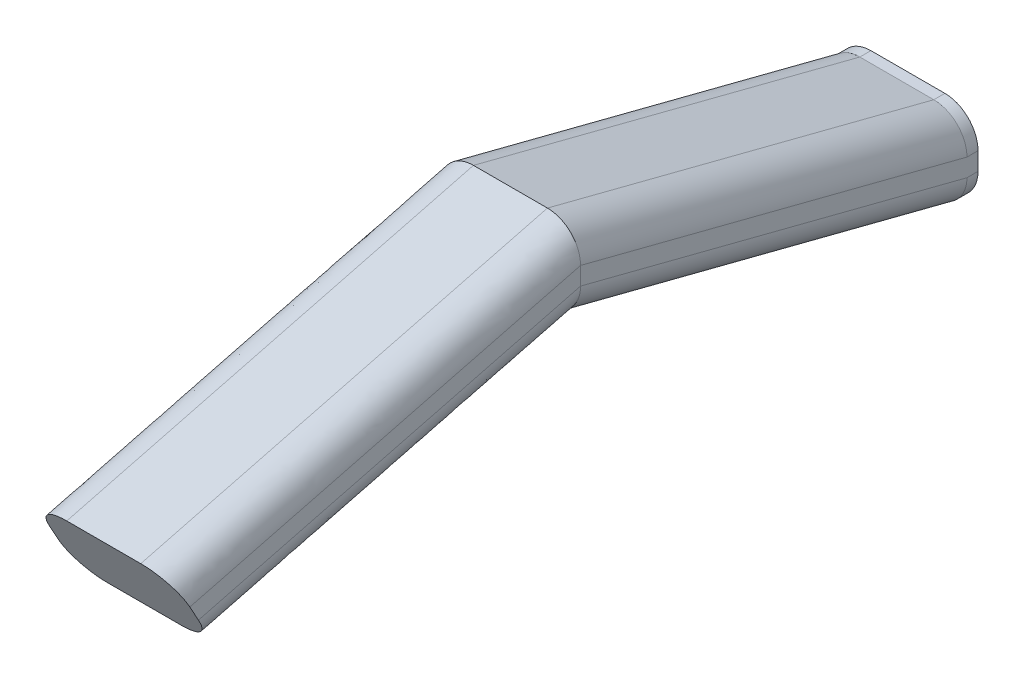
ISO-10303-21;
HEADER;
FILE_DESCRIPTION(('STEP AP214'),'2;1');
FILE_NAME('part.step','',(''),(''),'','','');
FILE_SCHEMA(('AUTOMOTIVE_DESIGN { 1 0 10303 214 1 1 1 1 }'));
ENDSEC;
DATA;
#1=APPLICATION_CONTEXT('core data for automotive mechanical design processes');
#2=APPLICATION_PROTOCOL_DEFINITION('international standard','automotive_design',2000,#1);
#3=PRODUCT_CONTEXT('',#1,'mechanical');
#4=PRODUCT('Part','Part','',(#3));
#5=PRODUCT_RELATED_PRODUCT_CATEGORY('part','',(#4));
#6=PRODUCT_DEFINITION_FORMATION('','',#4);
#7=PRODUCT_DEFINITION_CONTEXT('part definition',#1,'design');
#8=PRODUCT_DEFINITION('design','',#6,#7);
#9=PRODUCT_DEFINITION_SHAPE('','',#8);
#10=(LENGTH_UNIT() NAMED_UNIT(*) SI_UNIT(.MILLI.,.METRE.));
#11=(NAMED_UNIT(*) PLANE_ANGLE_UNIT() SI_UNIT($,.RADIAN.));
#12=(NAMED_UNIT(*) SI_UNIT($,.STERADIAN.) SOLID_ANGLE_UNIT());
#13=UNCERTAINTY_MEASURE_WITH_UNIT(LENGTH_MEASURE(1.E-05),#10,'distance_accuracy_value','');
#14=(GEOMETRIC_REPRESENTATION_CONTEXT(3) GLOBAL_UNCERTAINTY_ASSIGNED_CONTEXT((#13)) GLOBAL_UNIT_ASSIGNED_CONTEXT((#10,
#11,#12)) REPRESENTATION_CONTEXT('',''));
#15=CARTESIAN_POINT('',(0.,0.,0.));
#16=DIRECTION('',(0.,0.,1.));
#17=DIRECTION('',(1.,0.,0.));
#18=AXIS2_PLACEMENT_3D('',#15,#16,#17);
#19=CARTESIAN_POINT('',(-33.5,-8.1,10.));
#20=DIRECTION('',(0.,0.,-1.));
#21=DIRECTION('',(-1.,0.,0.));
#22=AXIS2_PLACEMENT_3D('',#19,#20,#21);
#23=CYLINDRICAL_SURFACE('',#22,30.);
#24=CARTESIAN_POINT('',(-33.5,-8.1,0.));
#25=DIRECTION('',(0.,0.,1.));
#26=DIRECTION('',(-1.,0.,0.));
#27=AXIS2_PLACEMENT_3D('',#24,#25,#26);
#28=CIRCLE('',#27,30.);
#29=CARTESIAN_POINT('',(-63.5,-8.1,0.));
#30=VERTEX_POINT('',#29);
#31=CARTESIAN_POINT('',(-33.5,-38.1,0.));
#32=VERTEX_POINT('',#31);
#33=EDGE_CURVE('E167',#30,#32,#28,.T.);
#34=ORIENTED_EDGE('',*,*,#33,.T.);
#35=DIRECTION('',(0.,0.,-1.));
#36=VECTOR('',#35,1.);
#37=CARTESIAN_POINT('',(-33.5,-38.1,10.));
#38=LINE('',#37,#36);
#39=CARTESIAN_POINT('',(-33.5,-38.1,10.));
#40=VERTEX_POINT('',#39);
#41=EDGE_CURVE('E11',#40,#32,#38,.T.);
#42=ORIENTED_EDGE('',*,*,#41,.F.);
#43=CARTESIAN_POINT('',(-33.5,-8.1,10.));
#44=DIRECTION('',(0.,0.,1.));
#45=DIRECTION('',(-1.,0.,0.));
#46=AXIS2_PLACEMENT_3D('',#43,#44,#45);
#47=CIRCLE('',#46,30.);
#48=CARTESIAN_POINT('',(-63.5,-8.09999999999998,10.));
#49=VERTEX_POINT('',#48);
#50=EDGE_CURVE('E159',#49,#40,#47,.T.);
#51=ORIENTED_EDGE('',*,*,#50,.F.);
#52=DIRECTION('',(0.,0.,-1.));
#53=VECTOR('',#52,1.);
#54=CARTESIAN_POINT('',(-63.5,-8.1,10.));
#55=LINE('',#54,#53);
#56=EDGE_CURVE('E166',#49,#30,#55,.T.);
#57=ORIENTED_EDGE('',*,*,#56,.T.);
#58=EDGE_LOOP('',(#34,#42,#51,#57));
#59=FACE_BOUND('',#58,.T.);
#60=ADVANCED_FACE('F33',(#59),#23,.T.);
#61=CARTESIAN_POINT('',(-33.5,-38.1,10.));
#62=DIRECTION('',(0.,1.,0.));
#63=DIRECTION('',(0.,0.,1.));
#64=AXIS2_PLACEMENT_3D('',#61,#62,#63);
#65=PLANE('',#64);
#66=DIRECTION('',(1.,0.,0.));
#67=VECTOR('',#66,1.);
#68=CARTESIAN_POINT('',(-33.5,-38.1,0.));
#69=LINE('',#68,#67);
#70=CARTESIAN_POINT('',(33.5,-38.1,0.));
#71=VERTEX_POINT('',#70);
#72=EDGE_CURVE('E170',#32,#71,#69,.T.);
#73=ORIENTED_EDGE('',*,*,#72,.T.);
#74=DIRECTION('',(0.,0.,-1.));
#75=VECTOR('',#74,1.);
#76=CARTESIAN_POINT('',(33.5,-38.1,10.));
#77=LINE('',#76,#75);
#78=CARTESIAN_POINT('',(33.5,-38.1,10.));
#79=VERTEX_POINT('',#78);
#80=EDGE_CURVE('E41',#79,#71,#77,.T.);
#81=ORIENTED_EDGE('',*,*,#80,.F.);
#82=DIRECTION('',(1.,0.,0.));
#83=VECTOR('',#82,1.);
#84=CARTESIAN_POINT('',(-33.5,-38.1,10.));
#85=LINE('',#84,#83);
#86=EDGE_CURVE('E91',#40,#79,#85,.T.);
#87=ORIENTED_EDGE('',*,*,#86,.F.);
#88=ORIENTED_EDGE('',*,*,#41,.T.);
#89=EDGE_LOOP('',(#73,#81,#87,#88));
#90=FACE_BOUND('',#89,.T.);
#91=ADVANCED_FACE('F329',(#90),#65,.F.);
#92=CARTESIAN_POINT('',(33.5,-8.1,10.));
#93=DIRECTION('',(0.,0.,-1.));
#94=DIRECTION('',(-1.,0.,0.));
#95=AXIS2_PLACEMENT_3D('',#92,#93,#94);
#96=CYLINDRICAL_SURFACE('',#95,30.);
#97=CARTESIAN_POINT('',(33.5,-8.1,0.));
#98=DIRECTION('',(0.,0.,1.));
#99=DIRECTION('',(1.,0.,0.));
#100=AXIS2_PLACEMENT_3D('',#97,#98,#99);
#101=CIRCLE('',#100,30.);
#102=CARTESIAN_POINT('',(63.5,-8.1,0.));
#103=VERTEX_POINT('',#102);
#104=EDGE_CURVE('E173',#71,#103,#101,.T.);
#105=ORIENTED_EDGE('',*,*,#104,.T.);
#106=DIRECTION('',(0.,0.,-1.));
#107=VECTOR('',#106,1.);
#108=CARTESIAN_POINT('',(63.5,-8.1,10.));
#109=LINE('',#108,#107);
#110=CARTESIAN_POINT('',(63.5,-8.1,10.));
#111=VERTEX_POINT('',#110);
#112=EDGE_CURVE('E186',#111,#103,#109,.T.);
#113=ORIENTED_EDGE('',*,*,#112,.F.);
#114=CARTESIAN_POINT('',(33.5,-8.1,10.));
#115=DIRECTION('',(0.,0.,1.));
#116=DIRECTION('',(1.,0.,0.));
#117=AXIS2_PLACEMENT_3D('',#114,#115,#116);
#118=CIRCLE('',#117,30.);
#119=EDGE_CURVE('E139',#79,#111,#118,.T.);
#120=ORIENTED_EDGE('',*,*,#119,.F.);
#121=ORIENTED_EDGE('',*,*,#80,.T.);
#122=EDGE_LOOP('',(#105,#113,#120,#121));
#123=FACE_BOUND('',#122,.T.);
#124=ADVANCED_FACE('F192',(#123),#96,.T.);
#125=CARTESIAN_POINT('',(63.5,-8.1,10.));
#126=DIRECTION('',(-1.,0.,0.));
#127=DIRECTION('',(0.,0.,1.));
#128=AXIS2_PLACEMENT_3D('',#125,#126,#127);
#129=PLANE('',#128);
#130=DIRECTION('',(0.,1.,0.));
#131=VECTOR('',#130,1.);
#132=CARTESIAN_POINT('',(63.5,-8.1,0.));
#133=LINE('',#132,#131);
#134=CARTESIAN_POINT('',(63.5,8.1,0.));
#135=VERTEX_POINT('',#134);
#136=EDGE_CURVE('E175',#103,#135,#133,.T.);
#137=ORIENTED_EDGE('',*,*,#136,.T.);
#138=DIRECTION('',(0.,0.,-1.));
#139=VECTOR('',#138,1.);
#140=CARTESIAN_POINT('',(63.5,8.1,10.));
#141=LINE('',#140,#139);
#142=CARTESIAN_POINT('',(63.5,8.1,10.));
#143=VERTEX_POINT('',#142);
#144=EDGE_CURVE('E118',#143,#135,#141,.T.);
#145=ORIENTED_EDGE('',*,*,#144,.F.);
#146=DIRECTION('',(0.,-0.249041039810618,-0.96849293259685));
#147=VECTOR('',#146,1.);
#148=CARTESIAN_POINT('',(63.5,98.1,360.));
#149=LINE('',#148,#147);
#150=CARTESIAN_POINT('',(63.5,98.0999999999999,360.));
#151=VERTEX_POINT('',#150);
#152=EDGE_CURVE('E138',#151,#143,#149,.T.);
#153=ORIENTED_EDGE('',*,*,#152,.F.);
#154=DIRECTION('',(0.,-1.,0.));
#155=VECTOR('',#154,1.);
#156=CARTESIAN_POINT('',(63.5,-7.09525267993879,360.));
#157=LINE('',#156,#155);
#158=CARTESIAN_POINT('',(63.5,81.9,360.));
#159=VERTEX_POINT('',#158);
#160=EDGE_CURVE('E378',#151,#159,#157,.T.);
#161=ORIENTED_EDGE('',*,*,#160,.T.);
#162=DIRECTION('',(0.,-0.249041039810618,-0.96849293259685));
#163=VECTOR('',#162,1.);
#164=CARTESIAN_POINT('',(63.5,81.9,360.));
#165=LINE('',#164,#163);
#166=EDGE_CURVE('E149',#159,#111,#165,.T.);
#167=ORIENTED_EDGE('',*,*,#166,.T.);
#168=ORIENTED_EDGE('',*,*,#112,.T.);
#169=EDGE_LOOP('',(#137,#145,#153,#161,#167,#168));
#170=FACE_BOUND('',#169,.T.);
#171=ADVANCED_FACE('F198',(#170),#129,.F.);
#172=CARTESIAN_POINT('',(33.5,8.1,10.));
#173=DIRECTION('',(0.,0.,-1.));
#174=DIRECTION('',(-1.,0.,0.));
#175=AXIS2_PLACEMENT_3D('',#172,#173,#174);
#176=CYLINDRICAL_SURFACE('',#175,30.);
#177=CARTESIAN_POINT('',(33.5,8.1,0.));
#178=DIRECTION('',(0.,0.,1.));
#179=DIRECTION('',(-1.,0.,0.));
#180=AXIS2_PLACEMENT_3D('',#177,#178,#179);
#181=CIRCLE('',#180,30.);
#182=CARTESIAN_POINT('',(33.5,38.1,0.));
#183=VERTEX_POINT('',#182);
#184=EDGE_CURVE('E115',#135,#183,#181,.T.);
#185=ORIENTED_EDGE('',*,*,#184,.T.);
#186=DIRECTION('',(0.,0.,-1.));
#187=VECTOR('',#186,1.);
#188=CARTESIAN_POINT('',(33.5,38.1,10.));
#189=LINE('',#188,#187);
#190=CARTESIAN_POINT('',(33.5,38.1,10.));
#191=VERTEX_POINT('',#190);
#192=EDGE_CURVE('E107',#191,#183,#189,.T.);
#193=ORIENTED_EDGE('',*,*,#192,.F.);
#194=CARTESIAN_POINT('',(33.5,8.1,10.));
#195=DIRECTION('',(0.,0.,1.));
#196=DIRECTION('',(-1.,0.,0.));
#197=AXIS2_PLACEMENT_3D('',#194,#195,#196);
#198=CIRCLE('',#197,30.);
#199=EDGE_CURVE('E112',#143,#191,#198,.T.);
#200=ORIENTED_EDGE('',*,*,#199,.F.);
#201=ORIENTED_EDGE('',*,*,#144,.T.);
#202=EDGE_LOOP('',(#185,#193,#200,#201));
#203=FACE_BOUND('',#202,.T.);
#204=ADVANCED_FACE('F109',(#203),#176,.T.);
#205=CARTESIAN_POINT('',(-33.5,38.1,10.));
#206=DIRECTION('',(0.,-1.,0.));
#207=DIRECTION('',(0.,0.,-1.));
#208=AXIS2_PLACEMENT_3D('',#205,#206,#207);
#209=PLANE('',#208);
#210=DIRECTION('',(-1.,0.,0.));
#211=VECTOR('',#210,1.);
#212=CARTESIAN_POINT('',(-33.5,38.1,0.));
#213=LINE('',#212,#211);
#214=CARTESIAN_POINT('',(-33.5,38.1,0.));
#215=VERTEX_POINT('',#214);
#216=EDGE_CURVE('E178',#183,#215,#213,.T.);
#217=ORIENTED_EDGE('',*,*,#216,.T.);
#218=DIRECTION('',(0.,0.,-1.));
#219=VECTOR('',#218,1.);
#220=CARTESIAN_POINT('',(-33.5,38.1,10.));
#221=LINE('',#220,#219);
#222=CARTESIAN_POINT('',(-33.5,38.1,10.));
#223=VERTEX_POINT('',#222);
#224=EDGE_CURVE('E119',#223,#215,#221,.T.);
#225=ORIENTED_EDGE('',*,*,#224,.F.);
#226=DIRECTION('',(-1.,0.,0.));
#227=VECTOR('',#226,1.);
#228=CARTESIAN_POINT('',(-33.5,38.1,10.));
#229=LINE('',#228,#227);
#230=EDGE_CURVE('E122',#191,#223,#229,.T.);
#231=ORIENTED_EDGE('',*,*,#230,.F.);
#232=ORIENTED_EDGE('',*,*,#192,.T.);
#233=EDGE_LOOP('',(#217,#225,#231,#232));
#234=FACE_BOUND('',#233,.T.);
#235=ADVANCED_FACE('F123',(#234),#209,.F.);
#236=CARTESIAN_POINT('',(-33.5,8.1,10.));
#237=DIRECTION('',(0.,0.,-1.));
#238=DIRECTION('',(-1.,0.,0.));
#239=AXIS2_PLACEMENT_3D('',#236,#237,#238);
#240=CYLINDRICAL_SURFACE('',#239,30.);
#241=CARTESIAN_POINT('',(-33.5,8.1,0.));
#242=DIRECTION('',(0.,0.,1.));
#243=DIRECTION('',(-1.,0.,0.));
#244=AXIS2_PLACEMENT_3D('',#241,#242,#243);
#245=CIRCLE('',#244,30.);
#246=CARTESIAN_POINT('',(-63.5,8.1,0.));
#247=VERTEX_POINT('',#246);
#248=EDGE_CURVE('E77',#215,#247,#245,.T.);
#249=ORIENTED_EDGE('',*,*,#248,.T.);
#250=DIRECTION('',(0.,0.,-1.));
#251=VECTOR('',#250,1.);
#252=CARTESIAN_POINT('',(-63.5,8.1,10.));
#253=LINE('',#252,#251);
#254=CARTESIAN_POINT('',(-63.5,8.1,10.));
#255=VERTEX_POINT('',#254);
#256=EDGE_CURVE('E49',#255,#247,#253,.T.);
#257=ORIENTED_EDGE('',*,*,#256,.F.);
#258=CARTESIAN_POINT('',(-33.5,8.1,10.));
#259=DIRECTION('',(0.,0.,1.));
#260=DIRECTION('',(-1.,0.,0.));
#261=AXIS2_PLACEMENT_3D('',#258,#259,#260);
#262=CIRCLE('',#261,30.);
#263=EDGE_CURVE('E128',#223,#255,#262,.T.);
#264=ORIENTED_EDGE('',*,*,#263,.F.);
#265=ORIENTED_EDGE('',*,*,#224,.T.);
#266=EDGE_LOOP('',(#249,#257,#264,#265));
#267=FACE_BOUND('',#266,.T.);
#268=ADVANCED_FACE('F335',(#267),#240,.T.);
#269=CARTESIAN_POINT('',(-63.5,-8.1,10.));
#270=DIRECTION('',(1.,0.,0.));
#271=DIRECTION('',(0.,0.,-1.));
#272=AXIS2_PLACEMENT_3D('',#269,#270,#271);
#273=PLANE('',#272);
#274=DIRECTION('',(0.,-1.,0.));
#275=VECTOR('',#274,1.);
#276=CARTESIAN_POINT('',(-63.5,-8.1,0.));
#277=LINE('',#276,#275);
#278=EDGE_CURVE('E83',#247,#30,#277,.T.);
#279=ORIENTED_EDGE('',*,*,#278,.T.);
#280=ORIENTED_EDGE('',*,*,#56,.F.);
#281=DIRECTION('',(0.,-0.249041039810618,-0.96849293259685));
#282=VECTOR('',#281,1.);
#283=CARTESIAN_POINT('',(-63.5,81.9,360.));
#284=LINE('',#283,#282);
#285=CARTESIAN_POINT('',(-63.5,81.9,360.));
#286=VERTEX_POINT('',#285);
#287=EDGE_CURVE('E155',#286,#49,#284,.T.);
#288=ORIENTED_EDGE('',*,*,#287,.F.);
#289=DIRECTION('',(0.,1.,0.));
#290=VECTOR('',#289,1.);
#291=CARTESIAN_POINT('',(-63.5,-7.09525267993878,360.));
#292=LINE('',#291,#290);
#293=CARTESIAN_POINT('',(-63.5,98.0999999999999,360.));
#294=VERTEX_POINT('',#293);
#295=EDGE_CURVE('E273',#286,#294,#292,.T.);
#296=ORIENTED_EDGE('',*,*,#295,.T.);
#297=DIRECTION('',(0.,-0.249041039810618,-0.96849293259685));
#298=VECTOR('',#297,1.);
#299=CARTESIAN_POINT('',(-63.5,98.1,360.));
#300=LINE('',#299,#298);
#301=EDGE_CURVE('E147',#294,#255,#300,.T.);
#302=ORIENTED_EDGE('',*,*,#301,.T.);
#303=ORIENTED_EDGE('',*,*,#256,.T.);
#304=EDGE_LOOP('',(#279,#280,#288,#296,#302,#303));
#305=FACE_BOUND('',#304,.T.);
#306=ADVANCED_FACE('F341',(#305),#273,.F.);
#307=CARTESIAN_POINT('',(-33.5,-8.1,0.));
#308=DIRECTION('',(0.,0.,-1.));
#309=DIRECTION('',(-1.,0.,0.));
#310=AXIS2_PLACEMENT_3D('',#307,#308,#309);
#311=PLANE('',#310);
#312=ORIENTED_EDGE('',*,*,#33,.F.);
#313=ORIENTED_EDGE('',*,*,#278,.F.);
#314=ORIENTED_EDGE('',*,*,#248,.F.);
#315=ORIENTED_EDGE('',*,*,#216,.F.);
#316=ORIENTED_EDGE('',*,*,#184,.F.);
#317=ORIENTED_EDGE('',*,*,#136,.F.);
#318=ORIENTED_EDGE('',*,*,#104,.F.);
#319=ORIENTED_EDGE('',*,*,#72,.F.);
#320=EDGE_LOOP('',(#312,#313,#314,#315,#316,#317,#318,#319));
#321=FACE_BOUND('',#320,.T.);
#322=ADVANCED_FACE('F196',(#321),#311,.T.);
#323=CARTESIAN_POINT('',(-33.5,-7.09525267993881,706.092649310873));
#324=DIRECTION('',(0.,0.482388973966309,-0.875957120980092));
#325=DIRECTION('',(-1.,0.,0.));
#326=AXIS2_PLACEMENT_3D('',#323,#324,#325);
#327=PLANE('',#326);
#328=CARTESIAN_POINT('',(-33.5,-7.09525267993881,706.092649310873));
#329=DIRECTION('',(0.,-0.482388973966309,0.875957120980092));
#330=DIRECTION('',(-1.,0.,0.));
#331=AXIS2_PLACEMENT_3D('',#328,#329,#330);
#332=CIRCLE('',#331,30.);
#333=CARTESIAN_POINT('',(-63.5,-7.0952526799388,706.092649310873));
#334=VERTEX_POINT('',#333);
#335=CARTESIAN_POINT('',(-33.5,-33.3739663093415,691.620980091884));
#336=VERTEX_POINT('',#335);
#337=EDGE_CURVE('E222',#334,#336,#332,.T.);
#338=ORIENTED_EDGE('',*,*,#337,.T.);
#339=DIRECTION('',(1.,0.,0.));
#340=VECTOR('',#339,1.);
#341=CARTESIAN_POINT('',(33.5,-33.3739663093415,691.620980091884));
#342=LINE('',#341,#340);
#343=CARTESIAN_POINT('',(33.5,-33.3739663093415,691.620980091884));
#344=VERTEX_POINT('',#343);
#345=EDGE_CURVE('E158',#336,#344,#342,.T.);
#346=ORIENTED_EDGE('',*,*,#345,.T.);
#347=CARTESIAN_POINT('',(33.5,-7.0952526799388,706.092649310873));
#348=DIRECTION('',(0.,-0.482388973966309,0.875957120980092));
#349=DIRECTION('',(1.,0.,0.));
#350=AXIS2_PLACEMENT_3D('',#347,#348,#349);
#351=CIRCLE('',#350,30.);
#352=CARTESIAN_POINT('',(63.5,-7.09525267993881,706.092649310873));
#353=VERTEX_POINT('',#352);
#354=EDGE_CURVE('E255',#344,#353,#351,.T.);
#355=ORIENTED_EDGE('',*,*,#354,.T.);
#356=DIRECTION('',(0.,0.875957120980092,0.482388973966309));
#357=VECTOR('',#356,1.);
#358=CARTESIAN_POINT('',(63.5,-7.09525267993881,706.092649310873));
#359=LINE('',#358,#357);
#360=CARTESIAN_POINT('',(63.5,7.09525267993866,713.907350689127));
#361=VERTEX_POINT('',#360);
#362=EDGE_CURVE('E249',#353,#361,#359,.T.);
#363=ORIENTED_EDGE('',*,*,#362,.T.);
#364=CARTESIAN_POINT('',(33.5,7.09525267993866,713.907350689127));
#365=DIRECTION('',(0.,-0.482388973966309,0.875957120980092));
#366=DIRECTION('',(1.,0.,0.));
#367=AXIS2_PLACEMENT_3D('',#364,#365,#366);
#368=CIRCLE('',#367,30.);
#369=CARTESIAN_POINT('',(33.5,33.3739663093414,728.379019908116));
#370=VERTEX_POINT('',#369);
#371=EDGE_CURVE('E244',#361,#370,#368,.T.);
#372=ORIENTED_EDGE('',*,*,#371,.T.);
#373=DIRECTION('',(-1.,0.,0.));
#374=VECTOR('',#373,1.);
#375=CARTESIAN_POINT('',(33.5,33.3739663093414,728.379019908116));
#376=LINE('',#375,#374);
#377=CARTESIAN_POINT('',(-33.5,33.3739663093414,728.379019908116));
#378=VERTEX_POINT('',#377);
#379=EDGE_CURVE('E238',#370,#378,#376,.T.);
#380=ORIENTED_EDGE('',*,*,#379,.T.);
#381=CARTESIAN_POINT('',(-33.5,7.09525267993866,713.907350689127));
#382=DIRECTION('',(0.,-0.482388973966309,0.875957120980092));
#383=DIRECTION('',(1.,0.,0.));
#384=AXIS2_PLACEMENT_3D('',#381,#382,#383);
#385=CIRCLE('',#384,30.);
#386=CARTESIAN_POINT('',(-63.5,7.09525267993866,713.907350689127));
#387=VERTEX_POINT('',#386);
#388=EDGE_CURVE('E232',#378,#387,#385,.T.);
#389=ORIENTED_EDGE('',*,*,#388,.T.);
#390=DIRECTION('',(0.,-0.875957120980092,-0.482388973966309));
#391=VECTOR('',#390,1.);
#392=CARTESIAN_POINT('',(-63.5,-7.0952526799388,706.092649310873));
#393=LINE('',#392,#391);
#394=EDGE_CURVE('E226',#387,#334,#393,.T.);
#395=ORIENTED_EDGE('',*,*,#394,.T.);
#396=EDGE_LOOP('',(#338,#346,#355,#363,#372,#380,#389,#395));
#397=FACE_BOUND('',#396,.T.);
#398=ADVANCED_FACE('F401',(#397),#327,.F.);
#399=CARTESIAN_POINT('',(33.5,51.9,360.));
#400=DIRECTION('',(0.,0.96849293259685,-0.249041039810618));
#401=DIRECTION('',(0.,0.249041039810618,0.96849293259685));
#402=AXIS2_PLACEMENT_3D('',#399,#400,#401);
#403=PLANE('',#402);
#404=DIRECTION('',(0.,-0.249041039810618,-0.96849293259685));
#405=VECTOR('',#404,1.);
#406=CARTESIAN_POINT('',(33.5,51.9,360.));
#407=LINE('',#406,#405);
#408=CARTESIAN_POINT('',(33.5,51.9,360.));
#409=VERTEX_POINT('',#408);
#410=EDGE_CURVE('E207',#409,#79,#407,.T.);
#411=ORIENTED_EDGE('',*,*,#410,.F.);
#412=DIRECTION('',(-1.,0.,0.));
#413=VECTOR('',#412,1.);
#414=CARTESIAN_POINT('',(33.5,51.9,360.));
#415=LINE('',#414,#413);
#416=CARTESIAN_POINT('',(-33.5,51.9,360.));
#417=VERTEX_POINT('',#416);
#418=EDGE_CURVE('E218',#409,#417,#415,.T.);
#419=ORIENTED_EDGE('',*,*,#418,.T.);
#420=DIRECTION('',(0.,-0.249041039810618,-0.96849293259685));
#421=VECTOR('',#420,1.);
#422=CARTESIAN_POINT('',(-33.5,51.9,360.));
#423=LINE('',#422,#421);
#424=EDGE_CURVE('E213',#417,#40,#423,.T.);
#425=ORIENTED_EDGE('',*,*,#424,.T.);
#426=ORIENTED_EDGE('',*,*,#86,.T.);
#427=EDGE_LOOP('',(#411,#419,#425,#426));
#428=FACE_BOUND('',#427,.T.);
#429=ADVANCED_FACE('F440',(#428),#403,.F.);
#430=CARTESIAN_POINT('',(33.5,51.9,360.));
#431=CARTESIAN_POINT('',(33.5,-38.1,10.));
#432=CARTESIAN_POINT('',(51.0735931288072,51.9,360.));
#433=CARTESIAN_POINT('',(51.0735931288071,-38.1,10.));
#434=CARTESIAN_POINT('',(63.5,64.3264068711928,360.));
#435=CARTESIAN_POINT('',(63.5,-25.6735931288071,10.));
#436=CARTESIAN_POINT('',(63.5,81.9,360.));
#437=CARTESIAN_POINT('',(63.5,-8.09999999999997,10.));
#438=(BOUNDED_SURFACE() B_SPLINE_SURFACE(3,1,((#430,#431),(#432,#433),(#434,#435),(#436,#437)),
.UNSPECIFIED.,.F.,.F.,.F.) B_SPLINE_SURFACE_WITH_KNOTS((4,4),(2,2),(0.,1.),(0.,1.),
.UNSPECIFIED.) GEOMETRIC_REPRESENTATION_ITEM() RATIONAL_B_SPLINE_SURFACE(((1.,1.),
(0.804737854124365,0.804737854124365),(0.804737854124365,0.804737854124365),(1.,1.))) REPRESENTATION_ITEM('') SURFACE());
#439=CARTESIAN_POINT('',(63.5,81.8999999999999,360.));
#440=CARTESIAN_POINT('',(63.5000177385678,81.337474590956,360.));
#441=CARTESIAN_POINT('',(63.4841788828631,80.7749519567934,360.));
#442=CARTESIAN_POINT('',(63.4209177590491,79.6517119567891,360.));
#443=CARTESIAN_POINT('',(63.3734969901135,79.090994506526,360.));
#444=CARTESIAN_POINT('',(63.247202837587,77.973120098514,360.));
#445=CARTESIAN_POINT('',(63.1683299741798,77.4159630820343,360.));
#446=CARTESIAN_POINT('',(62.979460799502,76.3073883272266,360.));
#447=CARTESIAN_POINT('',(62.8694878799413,75.7559665970942,360.));
#448=CARTESIAN_POINT('',(62.6187298330475,74.6601479895103,360.));
#449=CARTESIAN_POINT('',(62.4779450329038,74.1157510375282,360.));
#450=CARTESIAN_POINT('',(62.244026377033,73.3058197165925,360.));
#451=CARTESIAN_POINT('',(62.1622640491156,73.0369555749632,360.));
#452=CARTESIAN_POINT('',(61.9912033365166,72.5015777311625,360.));
#453=CARTESIAN_POINT('',(61.9019032942505,72.2350645602888,360.));
#454=CARTESIAN_POINT('',(61.5297315189907,71.1740962234525,360.));
#455=CARTESIAN_POINT('',(61.2169407468055,70.3898892465056,360.));
#456=CARTESIAN_POINT('',(60.5263556549067,68.8505606944399,360.));
#457=CARTESIAN_POINT('',(60.1485527788691,68.0954429638234,360.));
#458=CARTESIAN_POINT('',(59.5352656995742,66.9888320550448,360.));
#459=CARTESIAN_POINT('',(59.3230583296533,66.6242843171961,360.));
#460=CARTESIAN_POINT('',(58.883531701529,65.9045606452321,360.));
#461=CARTESIAN_POINT('',(58.6562167170879,65.5493821000664,360.));
#462=CARTESIAN_POINT('',(57.9520585463104,64.4986336819445,360.));
#463=CARTESIAN_POINT('',(57.4529665495443,63.8177868215473,360.));
#464=CARTESIAN_POINT('',(56.3992744386455,62.500650852692,360.));
#465=CARTESIAN_POINT('',(55.8446748658927,61.8643613097578,360.));
#466=CARTESIAN_POINT('',(54.6838294522497,60.6407320815048,360.));
#467=CARTESIAN_POINT('',(54.0775833356152,60.0533926575671,360.));
#468=CARTESIAN_POINT('',(52.8176495269963,58.931761645008,360.));
#469=CARTESIAN_POINT('',(52.1639523236332,58.3974807428604,360.));
#470=CARTESIAN_POINT('',(50.8138771316648,57.3858993460483,360.));
#471=CARTESIAN_POINT('',(50.1174998000834,56.9085979745663,360.));
#472=CARTESIAN_POINT('',(48.6868864269078,56.0142851972296,360.));
#473=CARTESIAN_POINT('',(47.9526438576007,55.5972842342139,360.));
#474=CARTESIAN_POINT('',(46.4515798403925,54.8266113415302,360.));
#475=CARTESIAN_POINT('',(45.6847563960447,54.4729432996358,360.));
#476=CARTESIAN_POINT('',(44.1244438931324,53.8316480408467,360.));
#477=CARTESIAN_POINT('',(43.330968308598,53.5439880128456,360.));
#478=CARTESIAN_POINT('',(41.7227226186996,53.0365725977323,360.));
#479=CARTESIAN_POINT('',(40.9079576833651,52.8168008874316,360.));
#480=CARTESIAN_POINT('',(39.5452887277915,52.5101831272035,360.));
#481=CARTESIAN_POINT('',(39.0017389818797,52.4036014105645,360.));
#482=CARTESIAN_POINT('',(37.9095829136868,52.2206797657887,360.));
#483=CARTESIAN_POINT('',(37.3609769829956,52.1443375154829,360.));
#484=CARTESIAN_POINT('',(36.2612096224272,52.0222268518438,360.));
#485=CARTESIAN_POINT('',(35.7100532195994,51.9764130428745,360.));
#486=CARTESIAN_POINT('',(34.6059334072326,51.9152884267005,360.));
#487=CARTESIAN_POINT('',(34.0529696360823,51.8999841522007,360.));
#488=CARTESIAN_POINT('',(33.5,51.9,360.));
#489=B_SPLINE_CURVE_WITH_KNOTS('',3,(#439,#440,#441,#442,#443,#444,#445,#446,#447,#448,#449,
#450,#451,#452,#453,#454,#455,#456,#457,#458,#459,#460,#461,#462,#463,#464,#465,#466,#467,#468,
#469,#470,#471,#472,#473,#474,#475,#476,#477,#478,#479,#480,#481,#482,#483,#484,#485,#486,#487,
#488),.UNSPECIFIED.,.F.,.F.,(4,2,2,2,2,2,2,2,2,2,2,2,2,2,2,2,2,2,2,2,2,2,2,2,4),(0.,
1.68734874440897,3.37461739713818,5.06185814542375,6.74783320618232,8.43379036454157,
9.27675446222096,10.1199044176601,12.6494788343587,15.1793864264855,16.4444965472181,
17.7092502944199,20.2385382636033,22.7678015663915,25.2970783739359,27.8268635722822,
30.3566098365406,32.8867936795272,35.4171327879304,37.9462113835078,40.4746814087261,
42.135615428982,43.7964218769659,45.4547531702417,47.1134395074695),.UNSPECIFIED.);
#490=EDGE_CURVE('E171',#159,#409,#489,.T.);
#491=ORIENTED_EDGE('',*,*,#166,.F.);
#492=ORIENTED_EDGE('',*,*,#490,.T.);
#493=ORIENTED_EDGE('',*,*,#410,.T.);
#494=ORIENTED_EDGE('',*,*,#119,.T.);
#495=EDGE_LOOP('',(#491,#492,#493,#494));
#496=FACE_BOUND('',#495,.T.);
#497=ADVANCED_FACE('F204',(#496),#438,.F.);
#498=CARTESIAN_POINT('',(63.5,98.1,360.));
#499=CARTESIAN_POINT('',(63.5,8.10000000000001,10.));
#500=CARTESIAN_POINT('',(63.5,115.673593128807,360.));
#501=CARTESIAN_POINT('',(63.5,25.6735931288071,10.));
#502=CARTESIAN_POINT('',(51.0735931288072,128.1,360.));
#503=CARTESIAN_POINT('',(51.0735931288071,38.1,10.));
#504=CARTESIAN_POINT('',(33.5,128.1,360.));
#505=CARTESIAN_POINT('',(33.5,38.1,10.));
#506=(BOUNDED_SURFACE() B_SPLINE_SURFACE(3,1,((#498,#499),(#500,#501),(#502,#503),(#504,#505)),
.UNSPECIFIED.,.F.,.F.,.F.) B_SPLINE_SURFACE_WITH_KNOTS((4,4),(2,2),(0.,1.),(0.,1.),
.UNSPECIFIED.) GEOMETRIC_REPRESENTATION_ITEM() RATIONAL_B_SPLINE_SURFACE(((1.,1.),
(0.804737854124365,0.804737854124365),(0.804737854124365,0.804737854124365),(1.,1.))) REPRESENTATION_ITEM('') SURFACE());
#507=DIRECTION('',(0.,-0.249041039810618,-0.96849293259685));
#508=VECTOR('',#507,1.);
#509=CARTESIAN_POINT('',(33.5,128.1,360.));
#510=LINE('',#509,#508);
#511=CARTESIAN_POINT('',(33.5,128.1,360.));
#512=VERTEX_POINT('',#511);
#513=EDGE_CURVE('E135',#512,#191,#510,.T.);
#514=CARTESIAN_POINT('',(33.5,128.1,360.));
#515=CARTESIAN_POINT('',(34.0625254090421,128.100017738565,360.));
#516=CARTESIAN_POINT('',(34.6250480432043,128.084178882864,360.));
#517=CARTESIAN_POINT('',(35.7482880432084,128.020917759054,360.));
#518=CARTESIAN_POINT('',(36.3090054934717,127.97349699012,360.));
#519=CARTESIAN_POINT('',(37.4268799014819,127.847202837576,360.));
#520=CARTESIAN_POINT('',(37.9840369179596,127.768329974151,360.));
#521=CARTESIAN_POINT('',(39.0926116727697,127.579460799476,360.));
#522=CARTESIAN_POINT('',(39.6440334029066,127.469487879936,360.));
#523=CARTESIAN_POINT('',(40.7398520104931,127.218729833055,360.));
#524=CARTESIAN_POINT('',(41.2842489624733,127.077945032903,360.));
#525=CARTESIAN_POINT('',(42.0941802834083,126.844026377031,360.));
#526=CARTESIAN_POINT('',(42.3630444250377,126.762264049115,360.));
#527=CARTESIAN_POINT('',(42.8984222688381,126.591203336517,360.));
#528=CARTESIAN_POINT('',(43.1649354397114,126.50190329425,360.));
#529=CARTESIAN_POINT('',(44.2259037765473,126.129731518991,360.));
#530=CARTESIAN_POINT('',(45.010110753496,125.816940746811,360.));
#531=CARTESIAN_POINT('',(46.5494393055564,125.126355654902,360.));
#532=CARTESIAN_POINT('',(47.3045570361656,124.74855277885,360.));
#533=CARTESIAN_POINT('',(48.4111679449496,124.135265699563,360.));
#534=CARTESIAN_POINT('',(48.7757156828029,123.92305832965,360.));
#535=CARTESIAN_POINT('',(49.4954393547704,123.483531701531,360.));
#536=CARTESIAN_POINT('',(49.8506178999351,123.256216717088,360.));
#537=CARTESIAN_POINT('',(50.9013663180549,122.552058546308,360.));
#538=CARTESIAN_POINT('',(51.5822131784527,122.052966549543,360.));
#539=CARTESIAN_POINT('',(52.8993491473082,120.999274438646,360.));
#540=CARTESIAN_POINT('',(53.5356386902421,120.444674865893,360.));
#541=CARTESIAN_POINT('',(54.759267918495,119.28382945225,360.));
#542=CARTESIAN_POINT('',(55.3466073424329,118.677583335615,360.));
#543=CARTESIAN_POINT('',(56.468238354992,117.417649526996,360.));
#544=CARTESIAN_POINT('',(57.0025192571395,116.763952323633,360.));
#545=CARTESIAN_POINT('',(58.0141006539518,115.413877131665,360.));
#546=CARTESIAN_POINT('',(58.4914020254343,114.717499800084,360.));
#547=CARTESIAN_POINT('',(59.3857148027699,113.286886426907,360.));
#548=CARTESIAN_POINT('',(59.8027157657839,112.552643857599,360.));
#549=CARTESIAN_POINT('',(60.5733886584724,111.051579840393,360.));
#550=CARTESIAN_POINT('',(60.9270567003733,110.284756396048,360.));
#551=CARTESIAN_POINT('',(61.5683519591622,108.724443893136,360.));
#552=CARTESIAN_POINT('',(61.8560119871566,107.930968308599,360.));
#553=CARTESIAN_POINT('',(62.3634274022653,106.322722618699,360.));
#554=CARTESIAN_POINT('',(62.583199112568,105.507957683365,360.));
#555=CARTESIAN_POINT('',(62.8898168727968,104.145288727792,360.));
#556=CARTESIAN_POINT('',(62.9963985894353,103.60173898188,360.));
#557=CARTESIAN_POINT('',(63.1793202342115,102.509582913687,360.));
#558=CARTESIAN_POINT('',(63.2556624845181,101.960976982996,360.));
#559=CARTESIAN_POINT('',(63.3777731481574,100.861209622427,360.));
#560=CARTESIAN_POINT('',(63.4235869571259,100.3100532196,360.));
#561=CARTESIAN_POINT('',(63.4847115732989,99.2059334072327,360.));
#562=CARTESIAN_POINT('',(63.5000158477985,98.6529696360822,360.));
#563=CARTESIAN_POINT('',(63.5,98.0999999999999,360.));
#564=B_SPLINE_CURVE_WITH_KNOTS('',3,(#514,#515,#516,#517,#518,#519,#520,#521,#522,#523,#524,
#525,#526,#527,#528,#529,#530,#531,#532,#533,#534,#535,#536,#537,#538,#539,#540,#541,#542,#543,
#544,#545,#546,#547,#548,#549,#550,#551,#552,#553,#554,#555,#556,#557,#558,#559,#560,#561,#562,
#563),.UNSPECIFIED.,.F.,.F.,(4,2,2,2,2,2,2,2,2,2,2,2,2,2,2,2,2,2,2,2,2,2,2,2,4),(0.,
1.68734874440614,3.37461739713491,5.06185814542299,6.74783320618303,8.43379036454155,
9.27675446222043,10.1199044176586,12.6494788343558,15.1793864264834,16.4444965472167,
17.7092502944185,20.2385382636009,22.7678015663888,25.2970783739335,27.8268635722798,
30.3566098365382,32.8867936795253,35.4171327879284,37.9462113835056,40.4746814087245,
42.1356154289804,43.7964218769643,45.4547531702399,47.113439507468),.UNSPECIFIED.);
#565=EDGE_CURVE('E294',#512,#151,#564,.T.);
#566=ORIENTED_EDGE('',*,*,#513,.F.);
#567=ORIENTED_EDGE('',*,*,#565,.T.);
#568=ORIENTED_EDGE('',*,*,#152,.T.);
#569=ORIENTED_EDGE('',*,*,#199,.T.);
#570=EDGE_LOOP('',(#566,#567,#568,#569));
#571=FACE_BOUND('',#570,.T.);
#572=ADVANCED_FACE('F132',(#571),#506,.F.);
#573=CARTESIAN_POINT('',(33.5,128.1,360.));
#574=DIRECTION('',(0.,-0.96849293259685,0.249041039810618));
#575=DIRECTION('',(0.,-0.249041039810618,-0.96849293259685));
#576=AXIS2_PLACEMENT_3D('',#573,#574,#575);
#577=PLANE('',#576);
#578=DIRECTION('',(0.,-0.249041039810618,-0.96849293259685));
#579=VECTOR('',#578,1.);
#580=CARTESIAN_POINT('',(-33.5,128.1,360.));
#581=LINE('',#580,#579);
#582=CARTESIAN_POINT('',(-33.5,128.1,360.));
#583=VERTEX_POINT('',#582);
#584=EDGE_CURVE('E145',#583,#223,#581,.T.);
#585=ORIENTED_EDGE('',*,*,#584,.F.);
#586=DIRECTION('',(1.,0.,0.));
#587=VECTOR('',#586,1.);
#588=CARTESIAN_POINT('',(33.5,128.1,360.));
#589=LINE('',#588,#587);
#590=EDGE_CURVE('E143',#583,#512,#589,.T.);
#591=ORIENTED_EDGE('',*,*,#590,.T.);
#592=ORIENTED_EDGE('',*,*,#513,.T.);
#593=ORIENTED_EDGE('',*,*,#230,.T.);
#594=EDGE_LOOP('',(#585,#591,#592,#593));
#595=FACE_BOUND('',#594,.T.);
#596=ADVANCED_FACE('F141',(#595),#577,.F.);
#597=CARTESIAN_POINT('',(-33.5,128.1,360.));
#598=CARTESIAN_POINT('',(-33.5,38.1,10.));
#599=CARTESIAN_POINT('',(-51.0735931288071,128.1,360.));
#600=CARTESIAN_POINT('',(-51.0735931288072,38.1,10.));
#601=CARTESIAN_POINT('',(-63.4999999999999,115.673593128807,360.));
#602=CARTESIAN_POINT('',(-63.5,25.6735931288071,10.));
#603=CARTESIAN_POINT('',(-63.5,98.1,360.));
#604=CARTESIAN_POINT('',(-63.5,8.1,10.));
#605=(BOUNDED_SURFACE() B_SPLINE_SURFACE(3,1,((#597,#598),(#599,#600),(#601,#602),(#603,#604)),
.UNSPECIFIED.,.F.,.F.,.F.) B_SPLINE_SURFACE_WITH_KNOTS((4,4),(2,2),(0.,1.),(0.,1.),
.UNSPECIFIED.) GEOMETRIC_REPRESENTATION_ITEM() RATIONAL_B_SPLINE_SURFACE(((1.,1.),
(0.804737854124365,0.804737854124365),(0.804737854124365,0.804737854124365),(1.,1.))) REPRESENTATION_ITEM('') SURFACE());
#606=CARTESIAN_POINT('',(-63.4999999999999,98.0999999999999,360.));
#607=CARTESIAN_POINT('',(-63.5000177385677,98.6625254090438,360.));
#608=CARTESIAN_POINT('',(-63.484178882863,99.2250480432065,360.));
#609=CARTESIAN_POINT('',(-63.420917759049,100.348288043211,360.));
#610=CARTESIAN_POINT('',(-63.3734969901134,100.909005493474,360.));
#611=CARTESIAN_POINT('',(-63.2472028375869,102.026879901486,360.));
#612=CARTESIAN_POINT('',(-63.1683299741797,102.584036917966,360.));
#613=CARTESIAN_POINT('',(-62.9794607995019,103.692611672773,360.));
#614=CARTESIAN_POINT('',(-62.8694878799412,104.244033402906,360.));
#615=CARTESIAN_POINT('',(-62.6187298330474,105.33985201049,360.));
#616=CARTESIAN_POINT('',(-62.4779450329038,105.884248962472,360.));
#617=CARTESIAN_POINT('',(-62.244026377033,106.694180283407,360.));
#618=CARTESIAN_POINT('',(-62.1622640491156,106.963044425037,360.));
#619=CARTESIAN_POINT('',(-61.9912033365165,107.498422268837,360.));
#620=CARTESIAN_POINT('',(-61.9019032942505,107.764935439711,360.));
#621=CARTESIAN_POINT('',(-61.5297315189906,108.825903776547,360.));
#622=CARTESIAN_POINT('',(-61.2169407468054,109.610110753494,360.));
#623=CARTESIAN_POINT('',(-60.5263556549066,111.14943930556,360.));
#624=CARTESIAN_POINT('',(-60.1485527788691,111.904557036177,360.));
#625=CARTESIAN_POINT('',(-59.5352656995741,113.011167944955,360.));
#626=CARTESIAN_POINT('',(-59.3230583296532,113.375715682804,360.));
#627=CARTESIAN_POINT('',(-58.8835317015289,114.095439354768,360.));
#628=CARTESIAN_POINT('',(-58.6562167170878,114.450617899933,360.));
#629=CARTESIAN_POINT('',(-57.9520585463103,115.501366318055,360.));
#630=CARTESIAN_POINT('',(-57.4529665495442,116.182213178453,360.));
#631=CARTESIAN_POINT('',(-56.3992744386454,117.499349147308,360.));
#632=CARTESIAN_POINT('',(-55.8446748658925,118.135638690242,360.));
#633=CARTESIAN_POINT('',(-54.6838294522496,119.359267918495,360.));
#634=CARTESIAN_POINT('',(-54.0775833356151,119.946607342433,360.));
#635=CARTESIAN_POINT('',(-52.8176495269962,121.068238354992,360.));
#636=CARTESIAN_POINT('',(-52.1639523236331,121.60251925714,360.));
#637=CARTESIAN_POINT('',(-50.8138771316647,122.614100653952,360.));
#638=CARTESIAN_POINT('',(-50.1174998000833,123.091402025434,360.));
#639=CARTESIAN_POINT('',(-48.6868864269077,123.98571480277,360.));
#640=CARTESIAN_POINT('',(-47.9526438576006,124.402715765786,360.));
#641=CARTESIAN_POINT('',(-46.4515798403924,125.17338865847,360.));
#642=CARTESIAN_POINT('',(-45.6847563960446,125.527056700364,360.));
#643=CARTESIAN_POINT('',(-44.1244438931323,126.168351959153,360.));
#644=CARTESIAN_POINT('',(-43.3309683085979,126.456011987154,360.));
#645=CARTESIAN_POINT('',(-41.7227226186996,126.963427402268,360.));
#646=CARTESIAN_POINT('',(-40.907957683365,127.183199112568,360.));
#647=CARTESIAN_POINT('',(-39.5452887277914,127.489816872796,360.));
#648=CARTESIAN_POINT('',(-39.0017389818796,127.596398589435,360.));
#649=CARTESIAN_POINT('',(-37.9095829136867,127.779320234211,360.));
#650=CARTESIAN_POINT('',(-37.3609769829955,127.855662484517,360.));
#651=CARTESIAN_POINT('',(-36.2612096224271,127.977773148156,360.));
#652=CARTESIAN_POINT('',(-35.7100532195994,128.023586957125,360.));
#653=CARTESIAN_POINT('',(-34.6059334072325,128.084711573299,360.));
#654=CARTESIAN_POINT('',(-34.0529696360822,128.100015847799,360.));
#655=CARTESIAN_POINT('',(-33.5,128.1,360.));
#656=B_SPLINE_CURVE_WITH_KNOTS('',3,(#606,#607,#608,#609,#610,#611,#612,#613,#614,#615,#616,
#617,#618,#619,#620,#621,#622,#623,#624,#625,#626,#627,#628,#629,#630,#631,#632,#633,#634,#635,
#636,#637,#638,#639,#640,#641,#642,#643,#644,#645,#646,#647,#648,#649,#650,#651,#652,#653,#654,
#655),.UNSPECIFIED.,.F.,.F.,(4,2,2,2,2,2,2,2,2,2,2,2,2,2,2,2,2,2,2,2,2,2,2,2,4),(0.,
1.68734874440896,3.37461739713818,5.06185814542375,6.74783320618229,8.43379036454158,
9.27675446222097,10.1199044176601,12.6494788343587,15.1793864264856,16.4444965472181,
17.7092502944199,20.2385382636034,22.7678015663916,25.297078373936,27.8268635722823,
30.3566098365406,32.8867936795272,35.4171327879304,37.9462113835078,40.4746814087261,
42.135615428982,43.7964218769659,45.4547531702417,47.1134395074695),.UNSPECIFIED.);
#657=EDGE_CURVE('E300',#294,#583,#656,.T.);
#658=ORIENTED_EDGE('',*,*,#301,.F.);
#659=ORIENTED_EDGE('',*,*,#657,.T.);
#660=ORIENTED_EDGE('',*,*,#584,.T.);
#661=ORIENTED_EDGE('',*,*,#263,.T.);
#662=EDGE_LOOP('',(#658,#659,#660,#661));
#663=FACE_BOUND('',#662,.T.);
#664=ADVANCED_FACE('F338',(#663),#605,.F.);
#665=CARTESIAN_POINT('',(-63.5,81.9,360.));
#666=CARTESIAN_POINT('',(-63.5,-8.09999999999998,10.));
#667=CARTESIAN_POINT('',(-63.5,64.3264068711928,360.));
#668=CARTESIAN_POINT('',(-63.5,-25.6735931288071,10.));
#669=CARTESIAN_POINT('',(-51.0735931288071,51.9,360.));
#670=CARTESIAN_POINT('',(-51.0735931288072,-38.1,10.));
#671=CARTESIAN_POINT('',(-33.5,51.9,360.));
#672=CARTESIAN_POINT('',(-33.5,-38.1,10.));
#673=(BOUNDED_SURFACE() B_SPLINE_SURFACE(3,1,((#665,#666),(#667,#668),(#669,#670),(#671,#672)),
.UNSPECIFIED.,.F.,.F.,.F.) B_SPLINE_SURFACE_WITH_KNOTS((4,4),(2,2),(0.,1.),(0.,1.),
.UNSPECIFIED.) GEOMETRIC_REPRESENTATION_ITEM() RATIONAL_B_SPLINE_SURFACE(((1.,1.),
(0.804737854124365,0.804737854124365),(0.804737854124365,0.804737854124365),(1.,1.))) REPRESENTATION_ITEM('') SURFACE());
#674=CARTESIAN_POINT('',(-33.5,51.9,360.));
#675=CARTESIAN_POINT('',(-34.062525409042,51.8999822614349,360.));
#676=CARTESIAN_POINT('',(-34.6250480432043,51.9158211171359,360.));
#677=CARTESIAN_POINT('',(-35.7482880432083,51.9790822409454,360.));
#678=CARTESIAN_POINT('',(-36.3090054934716,52.0265030098803,360.));
#679=CARTESIAN_POINT('',(-37.4268799014818,52.1527971624239,360.));
#680=CARTESIAN_POINT('',(-37.9840369179595,52.231670025849,360.));
#681=CARTESIAN_POINT('',(-39.0926116727696,52.420539200524,360.));
#682=CARTESIAN_POINT('',(-39.6440334029066,52.530512120064,360.));
#683=CARTESIAN_POINT('',(-40.739852010493,52.781270166945,360.));
#684=CARTESIAN_POINT('',(-41.2842489624732,52.9220549670966,360.));
#685=CARTESIAN_POINT('',(-42.0941802834083,53.1559736229689,360.));
#686=CARTESIAN_POINT('',(-42.3630444250377,53.2377359508851,360.));
#687=CARTESIAN_POINT('',(-42.8984222688381,53.4087966634833,360.));
#688=CARTESIAN_POINT('',(-43.1649354397113,53.4980967057496,360.));
#689=CARTESIAN_POINT('',(-44.2259037765472,53.8702684810089,360.));
#690=CARTESIAN_POINT('',(-45.010110753496,54.1830592531894,360.));
#691=CARTESIAN_POINT('',(-46.5494393055563,54.8736443450976,360.));
#692=CARTESIAN_POINT('',(-47.3045570361656,55.2514472211496,360.));
#693=CARTESIAN_POINT('',(-48.4111679449495,55.8647343004366,360.));
#694=CARTESIAN_POINT('',(-48.7757156828029,56.0769416703499,360.));
#695=CARTESIAN_POINT('',(-49.4954393547703,56.5164682984687,360.));
#696=CARTESIAN_POINT('',(-49.850617899935,56.7437832829117,360.));
#697=CARTESIAN_POINT('',(-50.9013663180549,57.4479414536921,360.));
#698=CARTESIAN_POINT('',(-51.5822131784526,57.9470334504565,360.));
#699=CARTESIAN_POINT('',(-52.8993491473081,59.0007255613539,360.));
#700=CARTESIAN_POINT('',(-53.535638690242,59.5553251341071,360.));
#701=CARTESIAN_POINT('',(-54.759267918495,60.7161705477503,360.));
#702=CARTESIAN_POINT('',(-55.3466073424328,61.3224166643847,360.));
#703=CARTESIAN_POINT('',(-56.468238354992,62.5823504730037,360.));
#704=CARTESIAN_POINT('',(-57.0025192571394,63.2360476763669,360.));
#705=CARTESIAN_POINT('',(-58.0141006539518,64.5861228683352,360.));
#706=CARTESIAN_POINT('',(-58.4914020254342,65.2825001999164,360.));
#707=CARTESIAN_POINT('',(-59.3857148027698,66.7131135730926,360.));
#708=CARTESIAN_POINT('',(-59.8027157657839,67.4473561424007,360.));
#709=CARTESIAN_POINT('',(-60.5733886584723,68.9484201596069,360.));
#710=CARTESIAN_POINT('',(-60.9270567003732,69.7152436039518,360.));
#711=CARTESIAN_POINT('',(-61.5683519591621,71.2755561068637,360.));
#712=CARTESIAN_POINT('',(-61.8560119871566,72.0690316914006,360.));
#713=CARTESIAN_POINT('',(-62.3634274022652,73.6772773813009,360.));
#714=CARTESIAN_POINT('',(-62.5831991125679,74.492042316635,360.));
#715=CARTESIAN_POINT('',(-62.8898168727967,75.8547112722084,360.));
#716=CARTESIAN_POINT('',(-62.9963985894352,76.3982610181203,360.));
#717=CARTESIAN_POINT('',(-63.1793202342114,77.4904170863132,360.));
#718=CARTESIAN_POINT('',(-63.255662484518,78.0390230170043,360.));
#719=CARTESIAN_POINT('',(-63.3777731481572,79.1387903775726,360.));
#720=CARTESIAN_POINT('',(-63.4235869571259,79.6899467804003,360.));
#721=CARTESIAN_POINT('',(-63.4847115732989,80.7940665927672,360.));
#722=CARTESIAN_POINT('',(-63.5000158477985,81.3470303639177,360.));
#723=CARTESIAN_POINT('',(-63.4999999999999,81.8999999999999,360.));
#724=B_SPLINE_CURVE_WITH_KNOTS('',3,(#674,#675,#676,#677,#678,#679,#680,#681,#682,#683,#684,
#685,#686,#687,#688,#689,#690,#691,#692,#693,#694,#695,#696,#697,#698,#699,#700,#701,#702,#703,
#704,#705,#706,#707,#708,#709,#710,#711,#712,#713,#714,#715,#716,#717,#718,#719,#720,#721,#722,
#723),.UNSPECIFIED.,.F.,.F.,(4,2,2,2,2,2,2,2,2,2,2,2,2,2,2,2,2,2,2,2,2,2,2,2,4),(0.,
1.68734874440614,3.37461739713491,5.06185814542301,6.74783320618304,8.43379036454157,
9.27675446222045,10.1199044176587,12.6494788343558,15.1793864264834,16.4444965472167,
17.7092502944186,20.2385382636009,22.7678015663888,25.2970783739335,27.8268635722798,
30.3566098365382,32.8867936795254,35.4171327879285,37.9462113835057,40.4746814087246,
42.1356154289805,43.7964218769644,45.4547531702399,47.113439507468),.UNSPECIFIED.);
#725=EDGE_CURVE('E220',#417,#286,#724,.T.);
#726=ORIENTED_EDGE('',*,*,#50,.T.);
#727=ORIENTED_EDGE('',*,*,#424,.F.);
#728=ORIENTED_EDGE('',*,*,#725,.T.);
#729=ORIENTED_EDGE('',*,*,#287,.T.);
#730=EDGE_LOOP('',(#726,#727,#728,#729));
#731=FACE_BOUND('',#730,.T.);
#732=ADVANCED_FACE('F325',(#731),#673,.F.);
#733=CARTESIAN_POINT('',(-63.5,-7.0952526799388,706.092649310873));
#734=CARTESIAN_POINT('',(-63.4999999999999,88.1282884837666,335.778878118685));
#735=CARTESIAN_POINT('',(-63.5,-22.4889667223242,697.615341752566));
#736=CARTESIAN_POINT('',(-63.5,72.7345744413812,327.301570560378));
#737=CARTESIAN_POINT('',(-51.0735931288071,-33.3739663093416,691.620980091884));
#738=CARTESIAN_POINT('',(-51.0735931288071,61.8495748543639,321.307208899696));
#739=CARTESIAN_POINT('',(-33.5,-33.3739663093415,691.620980091884));
#740=CARTESIAN_POINT('',(-33.5,61.8495748543639,321.307208899696));
#741=(BOUNDED_SURFACE() B_SPLINE_SURFACE(3,1,((#733,#734),(#735,#736),(#737,#738),(#739,#740)),
.UNSPECIFIED.,.F.,.F.,.F.) B_SPLINE_SURFACE_WITH_KNOTS((4,4),(2,2),(0.,1.),(0.,1.),
.UNSPECIFIED.) GEOMETRIC_REPRESENTATION_ITEM() RATIONAL_B_SPLINE_SURFACE(((1.,1.),
(0.804737854124365,0.804737854124365),(0.804737854124365,0.804737854124365),(1.,1.))) REPRESENTATION_ITEM('') SURFACE());
#742=DIRECTION('',(0.,0.249041039810619,-0.96849293259685));
#743=VECTOR('',#742,1.);
#744=CARTESIAN_POINT('',(-33.5,-33.3739663093415,691.620980091884));
#745=LINE('',#744,#743);
#746=EDGE_CURVE('E225',#336,#417,#745,.T.);
#747=DIRECTION('',(0.,0.249041039810619,-0.96849293259685));
#748=VECTOR('',#747,1.);
#749=CARTESIAN_POINT('',(-63.5,-7.0952526799388,706.092649310873));
#750=LINE('',#749,#748);
#751=EDGE_CURVE('E221',#334,#286,#750,.T.);
#752=ORIENTED_EDGE('',*,*,#746,.F.);
#753=ORIENTED_EDGE('',*,*,#337,.F.);
#754=ORIENTED_EDGE('',*,*,#751,.T.);
#755=ORIENTED_EDGE('',*,*,#725,.F.);
#756=EDGE_LOOP('',(#752,#753,#754,#755));
#757=FACE_BOUND('',#756,.T.);
#758=ADVANCED_FACE('F275',(#757),#741,.F.);
#759=CARTESIAN_POINT('',(-63.5,-7.0952526799388,706.092649310873));
#760=DIRECTION('',(1.,0.,0.));
#761=DIRECTION('',(0.,0.,-1.));
#762=AXIS2_PLACEMENT_3D('',#759,#760,#761);
#763=PLANE('',#762);
#764=ORIENTED_EDGE('',*,*,#751,.F.);
#765=ORIENTED_EDGE('',*,*,#394,.F.);
#766=DIRECTION('',(0.,0.249041039810619,-0.96849293259685));
#767=VECTOR('',#766,1.);
#768=CARTESIAN_POINT('',(-63.5,7.09525267993866,713.907350689127));
#769=LINE('',#768,#767);
#770=EDGE_CURVE('E229',#387,#294,#769,.T.);
#771=ORIENTED_EDGE('',*,*,#770,.T.);
#772=ORIENTED_EDGE('',*,*,#295,.F.);
#773=EDGE_LOOP('',(#764,#765,#771,#772));
#774=FACE_BOUND('',#773,.T.);
#775=ADVANCED_FACE('F313',(#774),#763,.F.);
#776=CARTESIAN_POINT('',(-33.5,33.3739663093414,728.379019908116));
#777=CARTESIAN_POINT('',(-33.5,128.597507473047,358.065248715929));
#778=CARTESIAN_POINT('',(-51.0735931288072,33.3739663093414,728.379019908116));
#779=CARTESIAN_POINT('',(-51.0735931288071,128.597507473047,358.065248715929));
#780=CARTESIAN_POINT('',(-63.5,22.4889667223241,722.384658247434));
#781=CARTESIAN_POINT('',(-63.4999999999999,117.71250788603,352.070887055246));
#782=CARTESIAN_POINT('',(-63.5,7.09525267993866,713.907350689127));
#783=CARTESIAN_POINT('',(-63.4999999999999,102.318793843644,343.593579496939));
#784=(BOUNDED_SURFACE() B_SPLINE_SURFACE(3,1,((#776,#777),(#778,#779),(#780,#781),(#782,#783)),
.UNSPECIFIED.,.F.,.F.,.F.) B_SPLINE_SURFACE_WITH_KNOTS((4,4),(2,2),(0.,1.),(0.,1.),
.UNSPECIFIED.) GEOMETRIC_REPRESENTATION_ITEM() RATIONAL_B_SPLINE_SURFACE(((1.,1.),
(0.804737854124365,0.804737854124365),(0.804737854124365,0.804737854124365),(1.,1.))) REPRESENTATION_ITEM('') SURFACE());
#785=DIRECTION('',(0.,0.249041039810619,-0.96849293259685));
#786=VECTOR('',#785,1.);
#787=CARTESIAN_POINT('',(-33.5,33.3739663093414,728.379019908116));
#788=LINE('',#787,#786);
#789=EDGE_CURVE('E235',#378,#583,#788,.T.);
#790=ORIENTED_EDGE('',*,*,#770,.F.);
#791=ORIENTED_EDGE('',*,*,#388,.F.);
#792=ORIENTED_EDGE('',*,*,#789,.T.);
#793=ORIENTED_EDGE('',*,*,#657,.F.);
#794=EDGE_LOOP('',(#790,#791,#792,#793));
#795=FACE_BOUND('',#794,.T.);
#796=ADVANCED_FACE('F306',(#795),#784,.F.);
#797=CARTESIAN_POINT('',(33.5,33.3739663093414,728.379019908116));
#798=DIRECTION('',(0.,-0.96849293259685,-0.249041039810619));
#799=DIRECTION('',(0.,0.249041039810619,-0.96849293259685));
#800=AXIS2_PLACEMENT_3D('',#797,#798,#799);
#801=PLANE('',#800);
#802=ORIENTED_EDGE('',*,*,#789,.F.);
#803=ORIENTED_EDGE('',*,*,#379,.F.);
#804=DIRECTION('',(0.,0.249041039810619,-0.96849293259685));
#805=VECTOR('',#804,1.);
#806=CARTESIAN_POINT('',(33.5,33.3739663093414,728.379019908116));
#807=LINE('',#806,#805);
#808=EDGE_CURVE('E241',#370,#512,#807,.T.);
#809=ORIENTED_EDGE('',*,*,#808,.T.);
#810=ORIENTED_EDGE('',*,*,#590,.F.);
#811=EDGE_LOOP('',(#802,#803,#809,#810));
#812=FACE_BOUND('',#811,.T.);
#813=ADVANCED_FACE('F312',(#812),#801,.F.);
#814=CARTESIAN_POINT('',(63.5,7.09525267993866,713.907350689127));
#815=CARTESIAN_POINT('',(63.5,102.318793843644,343.593579496939));
#816=CARTESIAN_POINT('',(63.5,22.4889667223241,722.384658247434));
#817=CARTESIAN_POINT('',(63.5,117.71250788603,352.070887055246));
#818=CARTESIAN_POINT('',(51.0735931288071,33.3739663093414,728.379019908116));
#819=CARTESIAN_POINT('',(51.0735931288072,128.597507473047,358.065248715929));
#820=CARTESIAN_POINT('',(33.5,33.3739663093414,728.379019908116));
#821=CARTESIAN_POINT('',(33.5,128.597507473047,358.065248715929));
#822=(BOUNDED_SURFACE() B_SPLINE_SURFACE(3,1,((#814,#815),(#816,#817),(#818,#819),(#820,#821)),
.UNSPECIFIED.,.F.,.F.,.F.) B_SPLINE_SURFACE_WITH_KNOTS((4,4),(2,2),(0.,1.),(0.,1.),
.UNSPECIFIED.) GEOMETRIC_REPRESENTATION_ITEM() RATIONAL_B_SPLINE_SURFACE(((1.,1.),
(0.804737854124365,0.804737854124365),(0.804737854124365,0.804737854124365),(1.,1.))) REPRESENTATION_ITEM('') SURFACE());
#823=DIRECTION('',(0.,0.249041039810619,-0.96849293259685));
#824=VECTOR('',#823,1.);
#825=CARTESIAN_POINT('',(63.5,7.09525267993866,713.907350689127));
#826=LINE('',#825,#824);
#827=EDGE_CURVE('E246',#361,#151,#826,.T.);
#828=ORIENTED_EDGE('',*,*,#808,.F.);
#829=ORIENTED_EDGE('',*,*,#371,.F.);
#830=ORIENTED_EDGE('',*,*,#827,.T.);
#831=ORIENTED_EDGE('',*,*,#565,.F.);
#832=EDGE_LOOP('',(#828,#829,#830,#831));
#833=FACE_BOUND('',#832,.T.);
#834=ADVANCED_FACE('F383',(#833),#822,.F.);
#835=CARTESIAN_POINT('',(63.5,-7.09525267993881,706.092649310873));
#836=DIRECTION('',(-1.,0.,0.));
#837=DIRECTION('',(0.,0.,1.));
#838=AXIS2_PLACEMENT_3D('',#835,#836,#837);
#839=PLANE('',#838);
#840=ORIENTED_EDGE('',*,*,#827,.F.);
#841=ORIENTED_EDGE('',*,*,#362,.F.);
#842=DIRECTION('',(0.,0.249041039810619,-0.96849293259685));
#843=VECTOR('',#842,1.);
#844=CARTESIAN_POINT('',(63.5,-7.09525267993881,706.092649310873));
#845=LINE('',#844,#843);
#846=EDGE_CURVE('E252',#353,#159,#845,.T.);
#847=ORIENTED_EDGE('',*,*,#846,.T.);
#848=ORIENTED_EDGE('',*,*,#160,.F.);
#849=EDGE_LOOP('',(#840,#841,#847,#848));
#850=FACE_BOUND('',#849,.T.);
#851=ADVANCED_FACE('F387',(#850),#839,.F.);
#852=CARTESIAN_POINT('',(33.5,-33.3739663093415,691.620980091884));
#853=CARTESIAN_POINT('',(33.5,61.8495748543639,321.307208899696));
#854=CARTESIAN_POINT('',(51.0735931288071,-33.3739663093416,691.620980091884));
#855=CARTESIAN_POINT('',(51.0735931288072,61.8495748543639,321.307208899696));
#856=CARTESIAN_POINT('',(63.5,-22.4889667223242,697.615341752566));
#857=CARTESIAN_POINT('',(63.5,72.7345744413812,327.301570560378));
#858=CARTESIAN_POINT('',(63.5,-7.09525267993881,706.092649310873));
#859=CARTESIAN_POINT('',(63.5,88.1282884837666,335.778878118685));
#860=(BOUNDED_SURFACE() B_SPLINE_SURFACE(3,1,((#852,#853),(#854,#855),(#856,#857),(#858,#859)),
.UNSPECIFIED.,.F.,.F.,.F.) B_SPLINE_SURFACE_WITH_KNOTS((4,4),(2,2),(0.,1.),(0.,1.),
.UNSPECIFIED.) GEOMETRIC_REPRESENTATION_ITEM() RATIONAL_B_SPLINE_SURFACE(((1.,1.),
(0.804737854124365,0.804737854124365),(0.804737854124365,0.804737854124365),(1.,1.))) REPRESENTATION_ITEM('') SURFACE());
#861=DIRECTION('',(0.,0.249041039810619,-0.96849293259685));
#862=VECTOR('',#861,1.);
#863=CARTESIAN_POINT('',(33.5,-33.3739663093415,691.620980091884));
#864=LINE('',#863,#862);
#865=EDGE_CURVE('E258',#344,#409,#864,.T.);
#866=ORIENTED_EDGE('',*,*,#846,.F.);
#867=ORIENTED_EDGE('',*,*,#354,.F.);
#868=ORIENTED_EDGE('',*,*,#865,.T.);
#869=ORIENTED_EDGE('',*,*,#490,.F.);
#870=EDGE_LOOP('',(#866,#867,#868,#869));
#871=FACE_BOUND('',#870,.T.);
#872=ADVANCED_FACE('F374',(#871),#860,.F.);
#873=CARTESIAN_POINT('',(33.5,-33.3739663093415,691.620980091884));
#874=DIRECTION('',(0.,0.96849293259685,0.249041039810619));
#875=DIRECTION('',(0.,-0.249041039810619,0.96849293259685));
#876=AXIS2_PLACEMENT_3D('',#873,#874,#875);
#877=PLANE('',#876);
#878=ORIENTED_EDGE('',*,*,#865,.F.);
#879=ORIENTED_EDGE('',*,*,#345,.F.);
#880=ORIENTED_EDGE('',*,*,#746,.T.);
#881=ORIENTED_EDGE('',*,*,#418,.F.);
#882=EDGE_LOOP('',(#878,#879,#880,#881));
#883=FACE_BOUND('',#882,.T.);
#884=ADVANCED_FACE('F283',(#883),#877,.F.);
#885=CLOSED_SHELL('',(#60,#91,#124,#171,#204,#235,#268,#306,#322,#398,#429,#497,#572,#596,#664,
#732,#758,#775,#796,#813,#834,#851,#872,#884));
#886=MANIFOLD_SOLID_BREP('B2',#885);
#887=ADVANCED_BREP_SHAPE_REPRESENTATION('',(#18,#886),#14);
#888=SHAPE_DEFINITION_REPRESENTATION(#9,#887);
ENDSEC;
END-ISO-10303-21;
